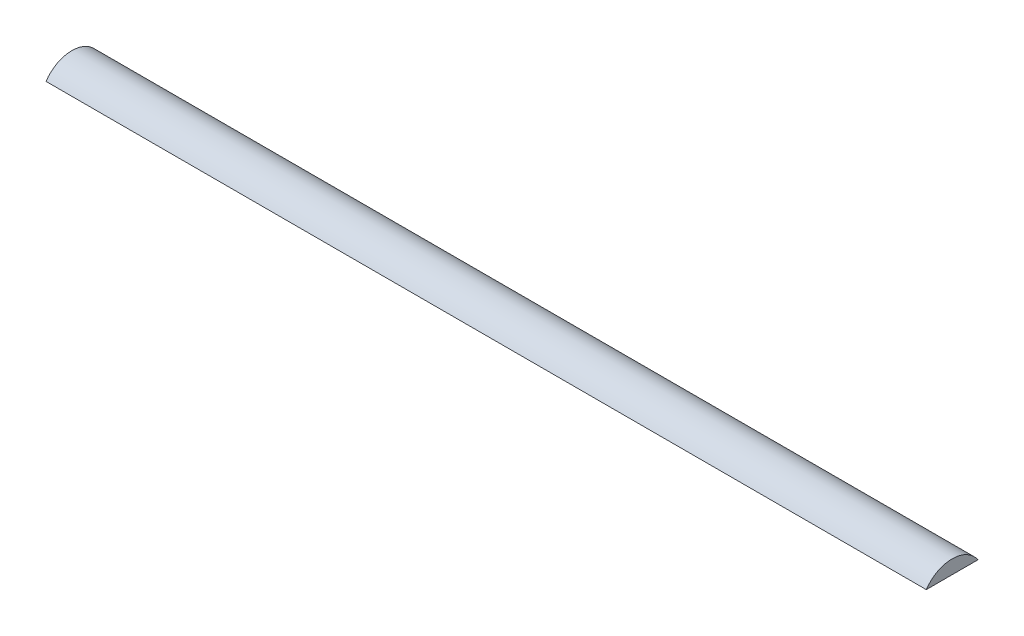
ISO-10303-21;
HEADER;
FILE_DESCRIPTION(('STEP AP214'),'2;1');
FILE_NAME('part.step','',(''),(''),'','','');
FILE_SCHEMA(('AUTOMOTIVE_DESIGN { 1 0 10303 214 1 1 1 1 }'));
ENDSEC;
DATA;
#1=APPLICATION_CONTEXT('core data for automotive mechanical design processes');
#2=APPLICATION_PROTOCOL_DEFINITION('international standard','automotive_design',2000,#1);
#3=PRODUCT_CONTEXT('',#1,'mechanical');
#4=PRODUCT('Part','Part','',(#3));
#5=PRODUCT_RELATED_PRODUCT_CATEGORY('part','',(#4));
#6=PRODUCT_DEFINITION_FORMATION('','',#4);
#7=PRODUCT_DEFINITION_CONTEXT('part definition',#1,'design');
#8=PRODUCT_DEFINITION('design','',#6,#7);
#9=PRODUCT_DEFINITION_SHAPE('','',#8);
#10=(LENGTH_UNIT() NAMED_UNIT(*) SI_UNIT(.MILLI.,.METRE.));
#11=(NAMED_UNIT(*) PLANE_ANGLE_UNIT() SI_UNIT($,.RADIAN.));
#12=(NAMED_UNIT(*) SI_UNIT($,.STERADIAN.) SOLID_ANGLE_UNIT());
#13=UNCERTAINTY_MEASURE_WITH_UNIT(LENGTH_MEASURE(1.E-05),#10,'distance_accuracy_value','');
#14=(GEOMETRIC_REPRESENTATION_CONTEXT(3) GLOBAL_UNCERTAINTY_ASSIGNED_CONTEXT((#13)) GLOBAL_UNIT_ASSIGNED_CONTEXT((#10,
#11,#12)) REPRESENTATION_CONTEXT('',''));
#15=CARTESIAN_POINT('',(0.,0.,0.));
#16=DIRECTION('',(0.,0.,1.));
#17=DIRECTION('',(1.,0.,0.));
#18=AXIS2_PLACEMENT_3D('',#15,#16,#17);
#19=CARTESIAN_POINT('',(800.,-15.84,0.));
#20=DIRECTION('',(-1.,0.,0.));
#21=DIRECTION('',(0.,0.,1.));
#22=AXIS2_PLACEMENT_3D('',#19,#20,#21);
#23=CYLINDRICAL_SURFACE('',#22,28.34);
#24=CARTESIAN_POINT('',(0.,-15.84,0.));
#25=DIRECTION('',(1.,0.,0.));
#26=DIRECTION('',(0.,0.,-1.));
#27=AXIS2_PLACEMENT_3D('',#24,#25,#26);
#28=CIRCLE('',#27,28.34);
#29=CARTESIAN_POINT('',(0.,0.,-23.5));
#30=VERTEX_POINT('',#29);
#31=CARTESIAN_POINT('',(0.,0.,23.5));
#32=VERTEX_POINT('',#31);
#33=EDGE_CURVE('E67',#30,#32,#28,.T.);
#34=ORIENTED_EDGE('',*,*,#33,.T.);
#35=DIRECTION('',(-1.,0.,0.));
#36=VECTOR('',#35,1.);
#37=CARTESIAN_POINT('',(800.,0.,23.5));
#38=LINE('',#37,#36);
#39=CARTESIAN_POINT('',(800.,0.,23.5));
#40=VERTEX_POINT('',#39);
#41=EDGE_CURVE('E11',#40,#32,#38,.T.);
#42=ORIENTED_EDGE('',*,*,#41,.F.);
#43=CARTESIAN_POINT('',(800.,-15.84,0.));
#44=DIRECTION('',(1.,0.,0.));
#45=DIRECTION('',(0.,0.,-1.));
#46=AXIS2_PLACEMENT_3D('',#43,#44,#45);
#47=CIRCLE('',#46,28.34);
#48=CARTESIAN_POINT('',(800.,0.,-23.5));
#49=VERTEX_POINT('',#48);
#50=EDGE_CURVE('E66',#49,#40,#47,.T.);
#51=ORIENTED_EDGE('',*,*,#50,.F.);
#52=DIRECTION('',(-1.,0.,0.));
#53=VECTOR('',#52,1.);
#54=CARTESIAN_POINT('',(800.,0.,-23.5));
#55=LINE('',#54,#53);
#56=EDGE_CURVE('E44',#49,#30,#55,.T.);
#57=ORIENTED_EDGE('',*,*,#56,.T.);
#58=EDGE_LOOP('',(#34,#42,#51,#57));
#59=FACE_BOUND('',#58,.T.);
#60=ADVANCED_FACE('F36',(#59),#23,.T.);
#61=CARTESIAN_POINT('',(800.,0.,-23.5));
#62=DIRECTION('',(0.,1.,0.));
#63=DIRECTION('',(0.,0.,1.));
#64=AXIS2_PLACEMENT_3D('',#61,#62,#63);
#65=PLANE('',#64);
#66=DIRECTION('',(0.,0.,-1.));
#67=VECTOR('',#66,1.);
#68=CARTESIAN_POINT('',(0.,0.,-23.5));
#69=LINE('',#68,#67);
#70=EDGE_CURVE('E59',#32,#30,#69,.T.);
#71=ORIENTED_EDGE('',*,*,#70,.T.);
#72=ORIENTED_EDGE('',*,*,#56,.F.);
#73=DIRECTION('',(0.,0.,-1.));
#74=VECTOR('',#73,1.);
#75=CARTESIAN_POINT('',(800.,0.,-23.5));
#76=LINE('',#75,#74);
#77=EDGE_CURVE('E51',#40,#49,#76,.T.);
#78=ORIENTED_EDGE('',*,*,#77,.F.);
#79=ORIENTED_EDGE('',*,*,#41,.T.);
#80=EDGE_LOOP('',(#71,#72,#78,#79));
#81=FACE_BOUND('',#80,.T.);
#82=ADVANCED_FACE('F62',(#81),#65,.F.);
#83=CARTESIAN_POINT('',(800.,-15.84,0.));
#84=DIRECTION('',(1.,0.,0.));
#85=DIRECTION('',(0.,0.,-1.));
#86=AXIS2_PLACEMENT_3D('',#83,#84,#85);
#87=PLANE('',#86);
#88=ORIENTED_EDGE('',*,*,#50,.T.);
#89=ORIENTED_EDGE('',*,*,#77,.T.);
#90=EDGE_LOOP('',(#88,#89));
#91=FACE_BOUND('',#90,.T.);
#92=ADVANCED_FACE('F74',(#91),#87,.T.);
#93=CARTESIAN_POINT('',(0.,-15.84,0.));
#94=DIRECTION('',(1.,0.,0.));
#95=DIRECTION('',(0.,0.,-1.));
#96=AXIS2_PLACEMENT_3D('',#93,#94,#95);
#97=PLANE('',#96);
#98=ORIENTED_EDGE('',*,*,#33,.F.);
#99=ORIENTED_EDGE('',*,*,#70,.F.);
#100=EDGE_LOOP('',(#98,#99));
#101=FACE_BOUND('',#100,.T.);
#102=ADVANCED_FACE('F70',(#101),#97,.F.);
#103=CLOSED_SHELL('',(#60,#82,#92,#102));
#104=MANIFOLD_SOLID_BREP('B2',#103);
#105=ADVANCED_BREP_SHAPE_REPRESENTATION('',(#18,#104),#14);
#106=SHAPE_DEFINITION_REPRESENTATION(#9,#105);
ENDSEC;
END-ISO-10303-21;
